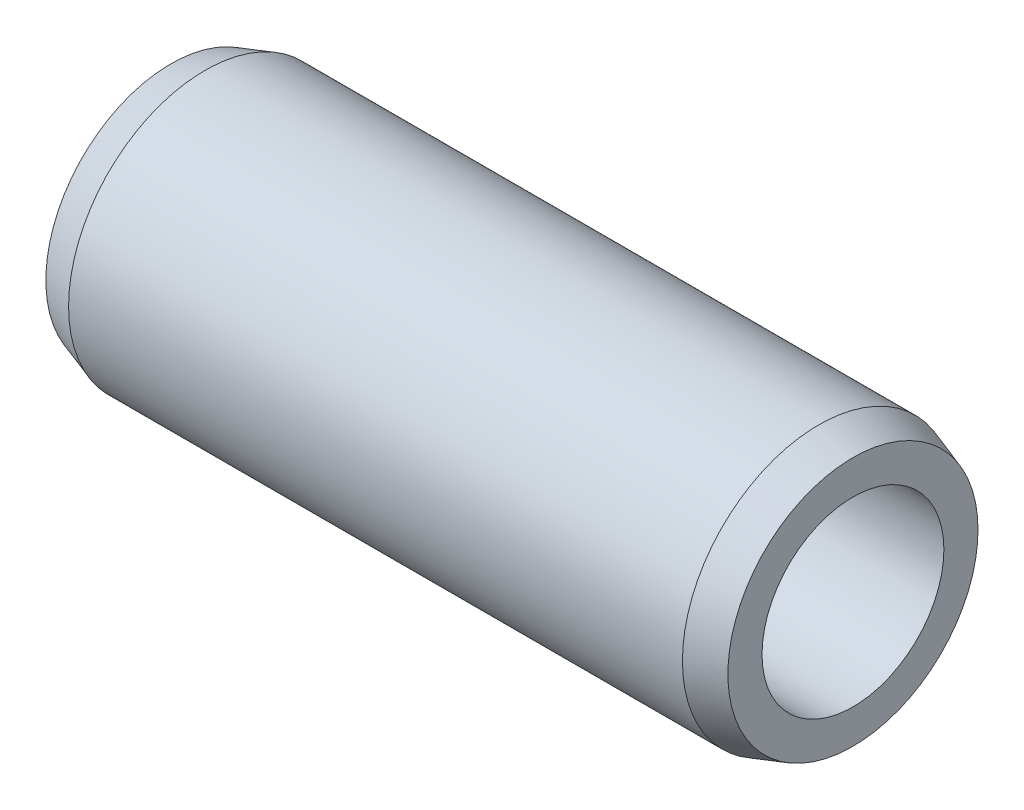
ISO-10303-21;
HEADER;
FILE_DESCRIPTION(('STEP AP214'),'2;1');
FILE_NAME('part.step','',(''),(''),'','','');
FILE_SCHEMA(('AUTOMOTIVE_DESIGN { 1 0 10303 214 1 1 1 1 }'));
ENDSEC;
DATA;
#1=APPLICATION_CONTEXT('core data for automotive mechanical design processes');
#2=APPLICATION_PROTOCOL_DEFINITION('international standard','automotive_design',2000,#1);
#3=PRODUCT_CONTEXT('',#1,'mechanical');
#4=PRODUCT('Part','Part','',(#3));
#5=PRODUCT_RELATED_PRODUCT_CATEGORY('part','',(#4));
#6=PRODUCT_DEFINITION_FORMATION('','',#4);
#7=PRODUCT_DEFINITION_CONTEXT('part definition',#1,'design');
#8=PRODUCT_DEFINITION('design','',#6,#7);
#9=PRODUCT_DEFINITION_SHAPE('','',#8);
#10=(LENGTH_UNIT() NAMED_UNIT(*) SI_UNIT(.MILLI.,.METRE.));
#11=(NAMED_UNIT(*) PLANE_ANGLE_UNIT() SI_UNIT($,.RADIAN.));
#12=(NAMED_UNIT(*) SI_UNIT($,.STERADIAN.) SOLID_ANGLE_UNIT());
#13=UNCERTAINTY_MEASURE_WITH_UNIT(LENGTH_MEASURE(1.E-05),#10,'distance_accuracy_value','');
#14=(GEOMETRIC_REPRESENTATION_CONTEXT(3) GLOBAL_UNCERTAINTY_ASSIGNED_CONTEXT((#13)) GLOBAL_UNIT_ASSIGNED_CONTEXT((#10,
#11,#12)) REPRESENTATION_CONTEXT('',''));
#15=CARTESIAN_POINT('',(0.,0.,0.));
#16=DIRECTION('',(0.,0.,1.));
#17=DIRECTION('',(1.,0.,0.));
#18=AXIS2_PLACEMENT_3D('',#15,#16,#17);
#19=CARTESIAN_POINT('',(30.,0.,0.));
#20=DIRECTION('',(1.,0.,0.));
#21=DIRECTION('',(0.,0.,-1.));
#22=AXIS2_PLACEMENT_3D('',#19,#20,#21);
#23=PLANE('',#22);
#24=CARTESIAN_POINT('',(30.,0.,0.));
#25=DIRECTION('',(1.,0.,0.));
#26=DIRECTION('',(0.,0.,-1.));
#27=AXIS2_PLACEMENT_3D('',#24,#25,#26);
#28=CIRCLE('',#27,5.5);
#29=CARTESIAN_POINT('',(30.,0.,-5.5));
#30=VERTEX_POINT('',#29);
#31=EDGE_CURVE('E45',#30,#30,#28,.T.);
#32=ORIENTED_EDGE('',*,*,#31,.T.);
#33=EDGE_LOOP('',(#32));
#34=FACE_BOUND('',#33,.T.);
#35=CARTESIAN_POINT('',(30.,0.,0.));
#36=DIRECTION('',(1.,0.,0.));
#37=DIRECTION('',(0.,0.,-1.));
#38=AXIS2_PLACEMENT_3D('',#35,#36,#37);
#39=CIRCLE('',#38,4.);
#40=CARTESIAN_POINT('',(30.,0.,-4.));
#41=VERTEX_POINT('',#40);
#42=EDGE_CURVE('E50',#41,#41,#39,.T.);
#43=ORIENTED_EDGE('',*,*,#42,.F.);
#44=EDGE_LOOP('',(#43));
#45=FACE_BOUND('',#44,.T.);
#46=ADVANCED_FACE('F30',(#34,#45),#23,.T.);
#47=CARTESIAN_POINT('',(0.,0.,0.));
#48=DIRECTION('',(1.,0.,0.));
#49=DIRECTION('',(0.,0.,-1.));
#50=AXIS2_PLACEMENT_3D('',#47,#48,#49);
#51=PLANE('',#50);
#52=CARTESIAN_POINT('',(0.,0.,0.));
#53=DIRECTION('',(1.,0.,0.));
#54=DIRECTION('',(0.,0.,-1.));
#55=AXIS2_PLACEMENT_3D('',#52,#53,#54);
#56=CIRCLE('',#55,5.5);
#57=CARTESIAN_POINT('',(0.,0.,-5.5));
#58=VERTEX_POINT('',#57);
#59=EDGE_CURVE('E10',#58,#58,#56,.F.);
#60=ORIENTED_EDGE('',*,*,#59,.T.);
#61=EDGE_LOOP('',(#60));
#62=FACE_BOUND('',#61,.T.);
#63=CARTESIAN_POINT('',(0.,0.,0.));
#64=DIRECTION('',(1.,0.,0.));
#65=DIRECTION('',(0.,0.,-1.));
#66=AXIS2_PLACEMENT_3D('',#63,#64,#65);
#67=CIRCLE('',#66,4.);
#68=CARTESIAN_POINT('',(0.,0.,-4.));
#69=VERTEX_POINT('',#68);
#70=EDGE_CURVE('E51',#69,#69,#67,.T.);
#71=ORIENTED_EDGE('',*,*,#70,.T.);
#72=EDGE_LOOP('',(#71));
#73=FACE_BOUND('',#72,.T.);
#74=ADVANCED_FACE('F61',(#62,#73),#51,.F.);
#75=CARTESIAN_POINT('',(30.,0.,0.));
#76=DIRECTION('',(-1.,0.,0.));
#77=DIRECTION('',(0.,0.,1.));
#78=AXIS2_PLACEMENT_3D('',#75,#76,#77);
#79=CYLINDRICAL_SURFACE('',#78,6.);
#80=CARTESIAN_POINT('',(28.5,0.,0.));
#81=DIRECTION('',(1.,0.,0.));
#82=DIRECTION('',(0.,0.,-1.));
#83=AXIS2_PLACEMENT_3D('',#80,#81,#82);
#84=CIRCLE('',#83,6.);
#85=CARTESIAN_POINT('',(28.5,0.,-6.));
#86=VERTEX_POINT('',#85);
#87=EDGE_CURVE('E37',#86,#86,#84,.F.);
#88=ORIENTED_EDGE('',*,*,#87,.T.);
#89=EDGE_LOOP('',(#88));
#90=FACE_BOUND('',#89,.T.);
#91=CARTESIAN_POINT('',(1.50000000000002,0.,0.));
#92=DIRECTION('',(1.,0.,0.));
#93=DIRECTION('',(0.,0.,-1.));
#94=AXIS2_PLACEMENT_3D('',#91,#92,#93);
#95=CIRCLE('',#94,6.);
#96=CARTESIAN_POINT('',(1.50000000000002,0.,-6.));
#97=VERTEX_POINT('',#96);
#98=EDGE_CURVE('E41',#97,#97,#95,.T.);
#99=ORIENTED_EDGE('',*,*,#98,.T.);
#100=EDGE_LOOP('',(#99));
#101=FACE_BOUND('',#100,.T.);
#102=ADVANCED_FACE('F67',(#90,#101),#79,.T.);
#103=CARTESIAN_POINT('',(30.,0.,0.));
#104=DIRECTION('',(-1.,0.,0.));
#105=DIRECTION('',(0.,0.,1.));
#106=AXIS2_PLACEMENT_3D('',#103,#104,#105);
#107=CYLINDRICAL_SURFACE('',#106,4.);
#108=ORIENTED_EDGE('',*,*,#42,.T.);
#109=EDGE_LOOP('',(#108));
#110=FACE_BOUND('',#109,.T.);
#111=ORIENTED_EDGE('',*,*,#70,.F.);
#112=EDGE_LOOP('',(#111));
#113=FACE_BOUND('',#112,.T.);
#114=ADVANCED_FACE('F57',(#110,#113),#107,.F.);
#115=CARTESIAN_POINT('',(30.,0.,0.));
#116=DIRECTION('',(-1.,0.,0.));
#117=DIRECTION('',(0.,0.,1.));
#118=AXIS2_PLACEMENT_3D('',#115,#116,#117);
#119=CONICAL_SURFACE('',#118,5.5,0.321750554396639);
#120=ORIENTED_EDGE('',*,*,#87,.F.);
#121=EDGE_LOOP('',(#120));
#122=FACE_BOUND('',#121,.T.);
#123=ORIENTED_EDGE('',*,*,#31,.F.);
#124=EDGE_LOOP('',(#123));
#125=FACE_BOUND('',#124,.T.);
#126=ADVANCED_FACE('F72',(#122,#125),#119,.T.);
#127=CARTESIAN_POINT('',(1.50000000000002,0.,0.));
#128=DIRECTION('',(1.,0.,0.));
#129=DIRECTION('',(0.,0.,-1.));
#130=AXIS2_PLACEMENT_3D('',#127,#128,#129);
#131=CONICAL_SURFACE('',#130,6.,0.321750554396639);
#132=ORIENTED_EDGE('',*,*,#59,.F.);
#133=EDGE_LOOP('',(#132));
#134=FACE_BOUND('',#133,.T.);
#135=ORIENTED_EDGE('',*,*,#98,.F.);
#136=EDGE_LOOP('',(#135));
#137=FACE_BOUND('',#136,.T.);
#138=ADVANCED_FACE('F32',(#134,#137),#131,.T.);
#139=CLOSED_SHELL('',(#46,#74,#102,#114,#126,#138));
#140=MANIFOLD_SOLID_BREP('B2',#139);
#141=ADVANCED_BREP_SHAPE_REPRESENTATION('',(#18,#140),#14);
#142=SHAPE_DEFINITION_REPRESENTATION(#9,#141);
ENDSEC;
END-ISO-10303-21;
